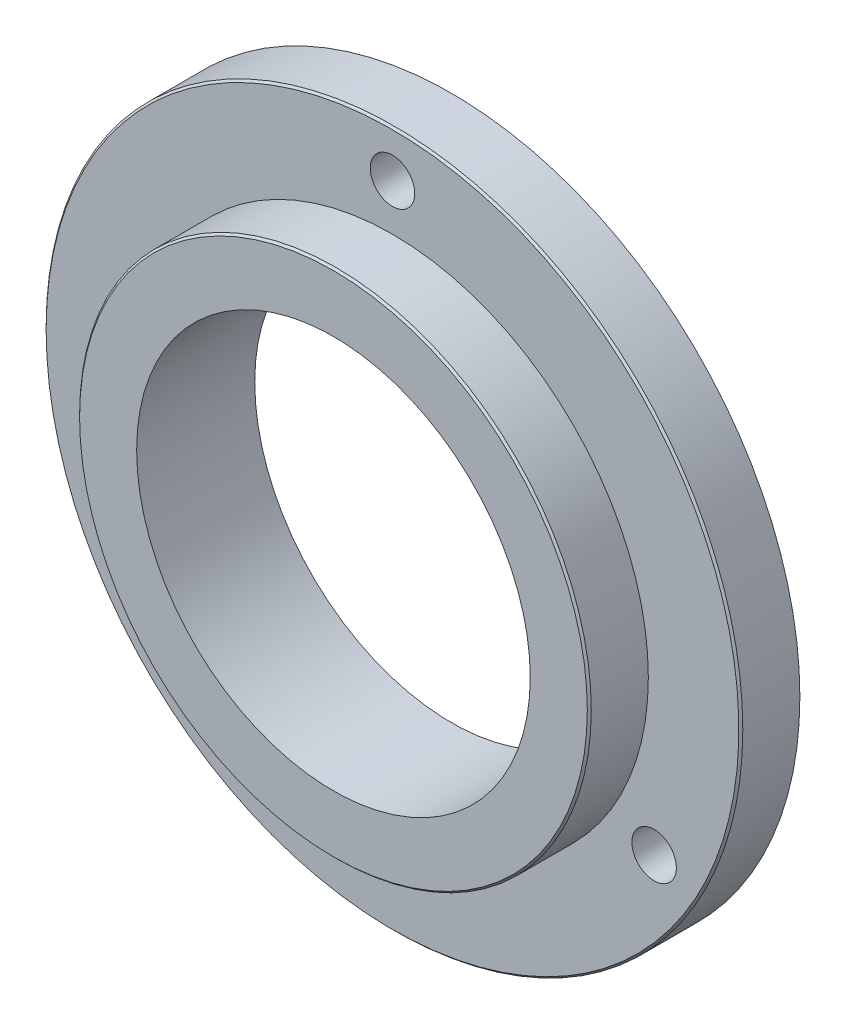
ISO-10303-21;
HEADER;
FILE_DESCRIPTION(('STEP AP214'),'2;1');
FILE_NAME('part.step','',(''),(''),'','','');
FILE_SCHEMA(('AUTOMOTIVE_DESIGN { 1 0 10303 214 1 1 1 1 }'));
ENDSEC;
DATA;
#1=APPLICATION_CONTEXT('core data for automotive mechanical design processes');
#2=APPLICATION_PROTOCOL_DEFINITION('international standard','automotive_design',2000,#1);
#3=PRODUCT_CONTEXT('',#1,'mechanical');
#4=PRODUCT('Part','Part','',(#3));
#5=PRODUCT_RELATED_PRODUCT_CATEGORY('part','',(#4));
#6=PRODUCT_DEFINITION_FORMATION('','',#4);
#7=PRODUCT_DEFINITION_CONTEXT('part definition',#1,'design');
#8=PRODUCT_DEFINITION('design','',#6,#7);
#9=PRODUCT_DEFINITION_SHAPE('','',#8);
#10=(LENGTH_UNIT() NAMED_UNIT(*) SI_UNIT(.MILLI.,.METRE.));
#11=(NAMED_UNIT(*) PLANE_ANGLE_UNIT() SI_UNIT($,.RADIAN.));
#12=(NAMED_UNIT(*) SI_UNIT($,.STERADIAN.) SOLID_ANGLE_UNIT());
#13=UNCERTAINTY_MEASURE_WITH_UNIT(LENGTH_MEASURE(1.E-05),#10,'distance_accuracy_value','');
#14=(GEOMETRIC_REPRESENTATION_CONTEXT(3) GLOBAL_UNCERTAINTY_ASSIGNED_CONTEXT((#13)) GLOBAL_UNIT_ASSIGNED_CONTEXT((#10,
#11,#12)) REPRESENTATION_CONTEXT('',''));
#15=CARTESIAN_POINT('',(0.,0.,0.));
#16=DIRECTION('',(0.,0.,1.));
#17=DIRECTION('',(1.,0.,0.));
#18=AXIS2_PLACEMENT_3D('',#15,#16,#17);
#19=CARTESIAN_POINT('',(0.,0.,3.));
#20=DIRECTION('',(0.,0.,1.));
#21=DIRECTION('',(1.,0.,0.));
#22=AXIS2_PLACEMENT_3D('',#19,#20,#21);
#23=PLANE('',#22);
#24=CARTESIAN_POINT('',(0.,0.,3.));
#25=DIRECTION('',(0.,0.,1.));
#26=DIRECTION('',(1.,0.,0.));
#27=AXIS2_PLACEMENT_3D('',#24,#25,#26);
#28=CIRCLE('',#27,12.9);
#29=CARTESIAN_POINT('',(12.9,0.,3.));
#30=VERTEX_POINT('',#29);
#31=EDGE_CURVE('E50',#30,#30,#28,.T.);
#32=ORIENTED_EDGE('',*,*,#31,.T.);
#33=EDGE_LOOP('',(#32));
#34=FACE_BOUND('',#33,.T.);
#35=CARTESIAN_POINT('',(0.,0.,3.));
#36=DIRECTION('',(0.,0.,1.));
#37=DIRECTION('',(1.,0.,0.));
#38=AXIS2_PLACEMENT_3D('',#35,#36,#37);
#39=CIRCLE('',#38,10.);
#40=CARTESIAN_POINT('',(10.,0.,3.));
#41=VERTEX_POINT('',#40);
#42=EDGE_CURVE('E68',#41,#41,#39,.T.);
#43=ORIENTED_EDGE('',*,*,#42,.F.);
#44=EDGE_LOOP('',(#43));
#45=FACE_BOUND('',#44,.T.);
#46=ADVANCED_FACE('F41',(#34,#45),#23,.T.);
#47=CARTESIAN_POINT('',(0.,0.,3.));
#48=DIRECTION('',(0.,0.,-1.));
#49=DIRECTION('',(-1.,0.,0.));
#50=AXIS2_PLACEMENT_3D('',#47,#48,#49);
#51=CYLINDRICAL_SURFACE('',#50,13.);
#52=CARTESIAN_POINT('',(0.,0.,2.9));
#53=DIRECTION('',(0.,0.,1.));
#54=DIRECTION('',(1.,0.,0.));
#55=AXIS2_PLACEMENT_3D('',#52,#53,#54);
#56=CIRCLE('',#55,13.);
#57=CARTESIAN_POINT('',(13.,0.,2.9));
#58=VERTEX_POINT('',#57);
#59=EDGE_CURVE('E10',#58,#58,#56,.F.);
#60=ORIENTED_EDGE('',*,*,#59,.T.);
#61=EDGE_LOOP('',(#60));
#62=FACE_BOUND('',#61,.T.);
#63=CARTESIAN_POINT('',(0.,0.,0.));
#64=DIRECTION('',(0.,0.,1.));
#65=DIRECTION('',(1.,0.,0.));
#66=AXIS2_PLACEMENT_3D('',#63,#64,#65);
#67=CIRCLE('',#66,13.);
#68=CARTESIAN_POINT('',(13.,0.,0.));
#69=VERTEX_POINT('',#68);
#70=EDGE_CURVE('E69',#69,#69,#67,.T.);
#71=ORIENTED_EDGE('',*,*,#70,.T.);
#72=EDGE_LOOP('',(#71));
#73=FACE_BOUND('',#72,.T.);
#74=ADVANCED_FACE('F125',(#62,#73),#51,.T.);
#75=CARTESIAN_POINT('',(0.,0.,3.));
#76=DIRECTION('',(0.,0.,-1.));
#77=DIRECTION('',(-1.,0.,0.));
#78=AXIS2_PLACEMENT_3D('',#75,#76,#77);
#79=CYLINDRICAL_SURFACE('',#78,10.);
#80=ORIENTED_EDGE('',*,*,#42,.T.);
#81=EDGE_LOOP('',(#80));
#82=FACE_BOUND('',#81,.T.);
#83=CARTESIAN_POINT('',(0.,0.,-3.));
#84=DIRECTION('',(0.,0.,-1.));
#85=DIRECTION('',(-1.,0.,0.));
#86=AXIS2_PLACEMENT_3D('',#83,#84,#85);
#87=CIRCLE('',#86,10.);
#88=CARTESIAN_POINT('',(-10.,0.,-3.));
#89=VERTEX_POINT('',#88);
#90=EDGE_CURVE('E80',#89,#89,#87,.T.);
#91=ORIENTED_EDGE('',*,*,#90,.T.);
#92=EDGE_LOOP('',(#91));
#93=FACE_BOUND('',#92,.T.);
#94=ADVANCED_FACE('F127',(#82,#93),#79,.F.);
#95=CARTESIAN_POINT('',(0.,0.,-3.));
#96=DIRECTION('',(0.,0.,-1.));
#97=DIRECTION('',(-1.,0.,0.));
#98=AXIS2_PLACEMENT_3D('',#95,#96,#97);
#99=PLANE('',#98);
#100=CARTESIAN_POINT('',(-13.2934899480912,-7.67499999999988,-3.));
#101=DIRECTION('',(0.,0.,1.));
#102=DIRECTION('',(1.,0.,0.));
#103=AXIS2_PLACEMENT_3D('',#100,#101,#102);
#104=CIRCLE('',#103,1.1303);
#105=CARTESIAN_POINT('',(-12.1631899480912,-7.67499999999988,-3.));
#106=VERTEX_POINT('',#105);
#107=EDGE_CURVE('E100',#106,#106,#104,.T.);
#108=ORIENTED_EDGE('',*,*,#107,.T.);
#109=EDGE_LOOP('',(#108));
#110=FACE_BOUND('',#109,.T.);
#111=CARTESIAN_POINT('',(13.2934899480911,-7.67500000000006,-3.));
#112=DIRECTION('',(0.,0.,1.));
#113=DIRECTION('',(1.,0.,0.));
#114=AXIS2_PLACEMENT_3D('',#111,#112,#113);
#115=CIRCLE('',#114,1.1303);
#116=CARTESIAN_POINT('',(14.4237899480911,-7.67500000000006,-3.));
#117=VERTEX_POINT('',#116);
#118=EDGE_CURVE('E92',#117,#117,#115,.T.);
#119=ORIENTED_EDGE('',*,*,#118,.T.);
#120=EDGE_LOOP('',(#119));
#121=FACE_BOUND('',#120,.T.);
#122=CARTESIAN_POINT('',(0.,15.35,-3.));
#123=DIRECTION('',(0.,0.,1.));
#124=DIRECTION('',(1.,0.,0.));
#125=AXIS2_PLACEMENT_3D('',#122,#123,#124);
#126=CIRCLE('',#125,1.1303);
#127=CARTESIAN_POINT('',(1.1303,15.35,-3.));
#128=VERTEX_POINT('',#127);
#129=EDGE_CURVE('E84',#128,#128,#126,.T.);
#130=ORIENTED_EDGE('',*,*,#129,.T.);
#131=EDGE_LOOP('',(#130));
#132=FACE_BOUND('',#131,.T.);
#133=CARTESIAN_POINT('',(0.,0.,-3.));
#134=DIRECTION('',(0.,0.,-1.));
#135=DIRECTION('',(-1.,0.,0.));
#136=AXIS2_PLACEMENT_3D('',#133,#134,#135);
#137=CIRCLE('',#136,17.7);
#138=CARTESIAN_POINT('',(-17.7,0.,-3.));
#139=VERTEX_POINT('',#138);
#140=EDGE_CURVE('E73',#139,#139,#137,.T.);
#141=ORIENTED_EDGE('',*,*,#140,.T.);
#142=EDGE_LOOP('',(#141));
#143=FACE_BOUND('',#142,.T.);
#144=ORIENTED_EDGE('',*,*,#90,.F.);
#145=EDGE_LOOP('',(#144));
#146=FACE_BOUND('',#145,.T.);
#147=ADVANCED_FACE('F116',(#110,#121,#132,#143,#146),#99,.T.);
#148=CARTESIAN_POINT('',(0.,0.,0.));
#149=DIRECTION('',(0.,0.,-1.));
#150=DIRECTION('',(-1.,0.,0.));
#151=AXIS2_PLACEMENT_3D('',#148,#149,#150);
#152=PLANE('',#151);
#153=CARTESIAN_POINT('',(0.,0.,0.));
#154=DIRECTION('',(0.,0.,-1.));
#155=DIRECTION('',(-1.,0.,0.));
#156=AXIS2_PLACEMENT_3D('',#153,#154,#155);
#157=CIRCLE('',#156,17.6);
#158=CARTESIAN_POINT('',(-17.6,0.,0.));
#159=VERTEX_POINT('',#158);
#160=EDGE_CURVE('E56',#159,#159,#157,.F.);
#161=ORIENTED_EDGE('',*,*,#160,.T.);
#162=EDGE_LOOP('',(#161));
#163=FACE_BOUND('',#162,.T.);
#164=CARTESIAN_POINT('',(-13.2934899480912,-7.67499999999988,0.));
#165=DIRECTION('',(0.,0.,1.));
#166=DIRECTION('',(1.,0.,0.));
#167=AXIS2_PLACEMENT_3D('',#164,#165,#166);
#168=CIRCLE('',#167,1.13029999999999);
#169=CARTESIAN_POINT('',(-12.1631899480912,-7.67499999999988,0.));
#170=VERTEX_POINT('',#169);
#171=EDGE_CURVE('E104',#170,#170,#168,.T.);
#172=ORIENTED_EDGE('',*,*,#171,.F.);
#173=EDGE_LOOP('',(#172));
#174=FACE_BOUND('',#173,.T.);
#175=CARTESIAN_POINT('',(13.2934899480911,-7.67500000000006,0.));
#176=DIRECTION('',(0.,0.,1.));
#177=DIRECTION('',(1.,0.,0.));
#178=AXIS2_PLACEMENT_3D('',#175,#176,#177);
#179=CIRCLE('',#178,1.13029999999999);
#180=CARTESIAN_POINT('',(14.4237899480911,-7.67500000000006,0.));
#181=VERTEX_POINT('',#180);
#182=EDGE_CURVE('E96',#181,#181,#179,.T.);
#183=ORIENTED_EDGE('',*,*,#182,.F.);
#184=EDGE_LOOP('',(#183));
#185=FACE_BOUND('',#184,.T.);
#186=CARTESIAN_POINT('',(0.,15.35,0.));
#187=DIRECTION('',(0.,0.,1.));
#188=DIRECTION('',(1.,0.,0.));
#189=AXIS2_PLACEMENT_3D('',#186,#187,#188);
#190=CIRCLE('',#189,1.13029999999999);
#191=CARTESIAN_POINT('',(1.13029999999999,15.35,0.));
#192=VERTEX_POINT('',#191);
#193=EDGE_CURVE('E88',#192,#192,#190,.T.);
#194=ORIENTED_EDGE('',*,*,#193,.F.);
#195=EDGE_LOOP('',(#194));
#196=FACE_BOUND('',#195,.T.);
#197=ORIENTED_EDGE('',*,*,#70,.F.);
#198=EDGE_LOOP('',(#197));
#199=FACE_BOUND('',#198,.T.);
#200=ADVANCED_FACE('F112',(#163,#174,#185,#196,#199),#152,.F.);
#201=CARTESIAN_POINT('',(0.,0.,-3.));
#202=DIRECTION('',(0.,0.,1.));
#203=DIRECTION('',(1.,0.,0.));
#204=AXIS2_PLACEMENT_3D('',#201,#202,#203);
#205=CYLINDRICAL_SURFACE('',#204,17.7);
#206=CARTESIAN_POINT('',(0.,0.,-0.0999999999999994));
#207=DIRECTION('',(0.,0.,-1.));
#208=DIRECTION('',(-1.,0.,0.));
#209=AXIS2_PLACEMENT_3D('',#206,#207,#208);
#210=CIRCLE('',#209,17.7);
#211=CARTESIAN_POINT('',(-17.7,0.,-0.0999999999999994));
#212=VERTEX_POINT('',#211);
#213=EDGE_CURVE('E62',#212,#212,#210,.T.);
#214=ORIENTED_EDGE('',*,*,#213,.T.);
#215=EDGE_LOOP('',(#214));
#216=FACE_BOUND('',#215,.T.);
#217=ORIENTED_EDGE('',*,*,#140,.F.);
#218=EDGE_LOOP('',(#217));
#219=FACE_BOUND('',#218,.T.);
#220=ADVANCED_FACE('F115',(#216,#219),#205,.T.);
#221=CARTESIAN_POINT('',(0.,15.35,0.));
#222=DIRECTION('',(0.,0.,1.));
#223=DIRECTION('',(1.,0.,0.));
#224=AXIS2_PLACEMENT_3D('',#221,#222,#223);
#225=CYLINDRICAL_SURFACE('',#224,1.13029999999999);
#226=ORIENTED_EDGE('',*,*,#129,.F.);
#227=EDGE_LOOP('',(#226));
#228=FACE_BOUND('',#227,.T.);
#229=ORIENTED_EDGE('',*,*,#193,.T.);
#230=EDGE_LOOP('',(#229));
#231=FACE_BOUND('',#230,.T.);
#232=ADVANCED_FACE('F156',(#228,#231),#225,.F.);
#233=CARTESIAN_POINT('',(13.2934899480911,-7.67500000000006,0.));
#234=DIRECTION('',(0.,0.,1.));
#235=DIRECTION('',(1.,0.,0.));
#236=AXIS2_PLACEMENT_3D('',#233,#234,#235);
#237=CYLINDRICAL_SURFACE('',#236,1.13029999999999);
#238=ORIENTED_EDGE('',*,*,#118,.F.);
#239=EDGE_LOOP('',(#238));
#240=FACE_BOUND('',#239,.T.);
#241=ORIENTED_EDGE('',*,*,#182,.T.);
#242=EDGE_LOOP('',(#241));
#243=FACE_BOUND('',#242,.T.);
#244=ADVANCED_FACE('F147',(#240,#243),#237,.F.);
#245=CARTESIAN_POINT('',(-13.2934899480912,-7.67499999999988,0.));
#246=DIRECTION('',(0.,0.,1.));
#247=DIRECTION('',(1.,0.,0.));
#248=AXIS2_PLACEMENT_3D('',#245,#246,#247);
#249=CYLINDRICAL_SURFACE('',#248,1.13029999999999);
#250=ORIENTED_EDGE('',*,*,#107,.F.);
#251=EDGE_LOOP('',(#250));
#252=FACE_BOUND('',#251,.T.);
#253=ORIENTED_EDGE('',*,*,#171,.T.);
#254=EDGE_LOOP('',(#253));
#255=FACE_BOUND('',#254,.T.);
#256=ADVANCED_FACE('F110',(#252,#255),#249,.F.);
#257=CARTESIAN_POINT('',(0.,0.,-0.0999999999999994));
#258=DIRECTION('',(0.,0.,-1.));
#259=DIRECTION('',(-1.,0.,0.));
#260=AXIS2_PLACEMENT_3D('',#257,#258,#259);
#261=CONICAL_SURFACE('',#260,17.7,0.785398163397431);
#262=ORIENTED_EDGE('',*,*,#160,.F.);
#263=EDGE_LOOP('',(#262));
#264=FACE_BOUND('',#263,.T.);
#265=ORIENTED_EDGE('',*,*,#213,.F.);
#266=EDGE_LOOP('',(#265));
#267=FACE_BOUND('',#266,.T.);
#268=ADVANCED_FACE('F137',(#264,#267),#261,.T.);
#269=CARTESIAN_POINT('',(0.,0.,3.));
#270=DIRECTION('',(0.,0.,-1.));
#271=DIRECTION('',(-1.,0.,0.));
#272=AXIS2_PLACEMENT_3D('',#269,#270,#271);
#273=CONICAL_SURFACE('',#272,12.9,0.785398163397466);
#274=ORIENTED_EDGE('',*,*,#59,.F.);
#275=EDGE_LOOP('',(#274));
#276=FACE_BOUND('',#275,.T.);
#277=ORIENTED_EDGE('',*,*,#31,.F.);
#278=EDGE_LOOP('',(#277));
#279=FACE_BOUND('',#278,.T.);
#280=ADVANCED_FACE('F44',(#276,#279),#273,.T.);
#281=CLOSED_SHELL('',(#46,#74,#94,#147,#200,#220,#232,#244,#256,#268,#280));
#282=MANIFOLD_SOLID_BREP('B2',#281);
#283=ADVANCED_BREP_SHAPE_REPRESENTATION('',(#18,#282),#14);
#284=SHAPE_DEFINITION_REPRESENTATION(#9,#283);
ENDSEC;
END-ISO-10303-21;
